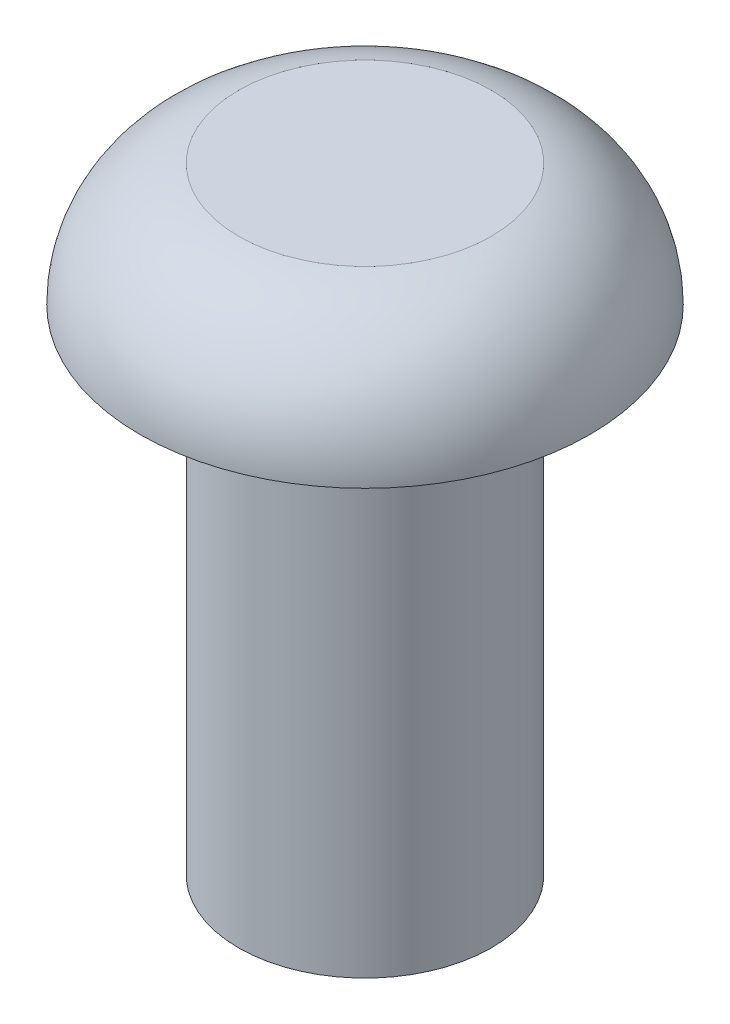
ISO-10303-21;
HEADER;
FILE_DESCRIPTION(('STEP AP214'),'2;1');
FILE_NAME('part.step','',(''),(''),'','','');
FILE_SCHEMA(('AUTOMOTIVE_DESIGN { 1 0 10303 214 1 1 1 1 }'));
ENDSEC;
DATA;
#1=APPLICATION_CONTEXT('core data for automotive mechanical design processes');
#2=APPLICATION_PROTOCOL_DEFINITION('international standard','automotive_design',2000,#1);
#3=PRODUCT_CONTEXT('',#1,'mechanical');
#4=PRODUCT('Part','Part','',(#3));
#5=PRODUCT_RELATED_PRODUCT_CATEGORY('part','',(#4));
#6=PRODUCT_DEFINITION_FORMATION('','',#4);
#7=PRODUCT_DEFINITION_CONTEXT('part definition',#1,'design');
#8=PRODUCT_DEFINITION('design','',#6,#7);
#9=PRODUCT_DEFINITION_SHAPE('','',#8);
#10=(LENGTH_UNIT() NAMED_UNIT(*) SI_UNIT(.MILLI.,.METRE.));
#11=(NAMED_UNIT(*) PLANE_ANGLE_UNIT() SI_UNIT($,.RADIAN.));
#12=(NAMED_UNIT(*) SI_UNIT($,.STERADIAN.) SOLID_ANGLE_UNIT());
#13=UNCERTAINTY_MEASURE_WITH_UNIT(LENGTH_MEASURE(1.E-05),#10,'distance_accuracy_value','');
#14=(GEOMETRIC_REPRESENTATION_CONTEXT(3) GLOBAL_UNCERTAINTY_ASSIGNED_CONTEXT((#13)) GLOBAL_UNIT_ASSIGNED_CONTEXT((#10,
#11,#12)) REPRESENTATION_CONTEXT('',''));
#15=CARTESIAN_POINT('',(0.,0.,0.));
#16=DIRECTION('',(0.,0.,1.));
#17=DIRECTION('',(1.,0.,0.));
#18=AXIS2_PLACEMENT_3D('',#15,#16,#17);
#19=CARTESIAN_POINT('',(0.,0.,0.));
#20=DIRECTION('',(0.,1.,0.));
#21=DIRECTION('',(-1.,0.,0.));
#22=AXIS2_PLACEMENT_3D('',#19,#20,#21);
#23=PLANE('',#22);
#24=CARTESIAN_POINT('',(0.,0.,0.));
#25=DIRECTION('',(0.,1.,0.));
#26=DIRECTION('',(-1.,0.,0.));
#27=AXIS2_PLACEMENT_3D('',#24,#25,#26);
#28=CIRCLE('',#27,1.6);
#29=CARTESIAN_POINT('',(-1.6,0.,0.));
#30=VERTEX_POINT('',#29);
#31=EDGE_CURVE('E10',#30,#30,#28,.T.);
#32=ORIENTED_EDGE('',*,*,#31,.F.);
#33=EDGE_LOOP('',(#32));
#34=FACE_BOUND('',#33,.T.);
#35=ADVANCED_FACE('F43',(#34),#23,.F.);
#36=CARTESIAN_POINT('',(0.,7.79836516202869,0.));
#37=DIRECTION('',(0.,1.,0.));
#38=DIRECTION('',(-1.,0.,0.));
#39=AXIS2_PLACEMENT_3D('',#36,#37,#38);
#40=CYLINDRICAL_SURFACE('',#39,1.6);
#41=CARTESIAN_POINT('',(0.,6.25,0.));
#42=DIRECTION('',(0.,1.,0.));
#43=DIRECTION('',(-1.,0.,0.));
#44=AXIS2_PLACEMENT_3D('',#41,#42,#43);
#45=CIRCLE('',#44,1.6);
#46=CARTESIAN_POINT('',(-1.6,6.25,0.));
#47=VERTEX_POINT('',#46);
#48=EDGE_CURVE('E50',#47,#47,#45,.T.);
#49=ORIENTED_EDGE('',*,*,#48,.F.);
#50=EDGE_LOOP('',(#49));
#51=FACE_BOUND('',#50,.T.);
#52=ORIENTED_EDGE('',*,*,#31,.T.);
#53=EDGE_LOOP('',(#52));
#54=FACE_BOUND('',#53,.T.);
#55=ADVANCED_FACE('F77',(#51,#54),#40,.T.);
#56=CARTESIAN_POINT('',(1.6,6.25,0.));
#57=DIRECTION('',(0.,1.,0.));
#58=DIRECTION('',(-1.,0.,0.));
#59=AXIS2_PLACEMENT_3D('',#56,#57,#58);
#60=PLANE('',#59);
#61=CARTESIAN_POINT('',(0.,6.25,0.));
#62=DIRECTION('',(0.,1.,0.));
#63=DIRECTION('',(-1.,0.,0.));
#64=AXIS2_PLACEMENT_3D('',#61,#62,#63);
#65=CIRCLE('',#64,2.84790622996616);
#66=CARTESIAN_POINT('',(-2.84790622996616,6.25,0.));
#67=VERTEX_POINT('',#66);
#68=EDGE_CURVE('E55',#67,#67,#65,.T.);
#69=ORIENTED_EDGE('',*,*,#68,.F.);
#70=EDGE_LOOP('',(#69));
#71=FACE_BOUND('',#70,.T.);
#72=ORIENTED_EDGE('',*,*,#48,.T.);
#73=EDGE_LOOP('',(#72));
#74=FACE_BOUND('',#73,.T.);
#75=ADVANCED_FACE('F72',(#71,#74),#60,.F.);
#76=CARTESIAN_POINT('',(0.,6.25,0.));
#77=DIRECTION('',(0.,1.,0.));
#78=DIRECTION('',(-1.,0.,0.));
#79=AXIS2_PLACEMENT_3D('',#76,#77,#78);
#80=DEGENERATE_TOROIDAL_SURFACE('',#79,1.26337025330078,1.58453597666538,.T.);
#81=CARTESIAN_POINT('',(0.,7.79836516202869,0.));
#82=DIRECTION('',(0.,1.,0.));
#83=DIRECTION('',(-1.,0.,0.));
#84=AXIS2_PLACEMENT_3D('',#81,#82,#83);
#85=CIRCLE('',#84,1.6);
#86=CARTESIAN_POINT('',(-1.6,7.79836516202869,0.));
#87=VERTEX_POINT('',#86);
#88=EDGE_CURVE('E60',#87,#87,#85,.T.);
#89=ORIENTED_EDGE('',*,*,#88,.F.);
#90=EDGE_LOOP('',(#89));
#91=FACE_BOUND('',#90,.T.);
#92=ORIENTED_EDGE('',*,*,#68,.T.);
#93=EDGE_LOOP('',(#92));
#94=FACE_BOUND('',#93,.T.);
#95=ADVANCED_FACE('F69',(#91,#94),#80,.T.);
#96=CARTESIAN_POINT('',(1.6,7.79836516202869,0.));
#97=DIRECTION('',(0.,-1.,0.));
#98=DIRECTION('',(1.,0.,0.));
#99=AXIS2_PLACEMENT_3D('',#96,#97,#98);
#100=PLANE('',#99);
#101=ORIENTED_EDGE('',*,*,#88,.T.);
#102=EDGE_LOOP('',(#101));
#103=FACE_BOUND('',#102,.T.);
#104=ADVANCED_FACE('F67',(#103),#100,.F.);
#105=CLOSED_SHELL('',(#35,#55,#75,#95,#104));
#106=MANIFOLD_SOLID_BREP('B2',#105);
#107=ADVANCED_BREP_SHAPE_REPRESENTATION('',(#18,#106),#14);
#108=SHAPE_DEFINITION_REPRESENTATION(#9,#107);
ENDSEC;
END-ISO-10303-21;
